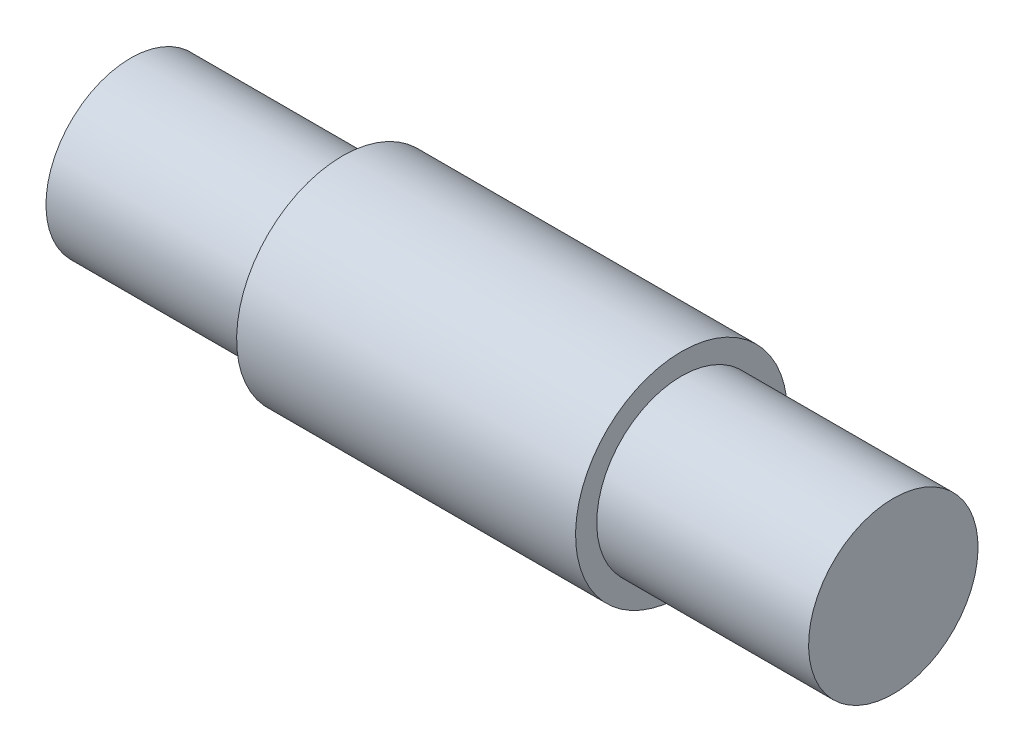
ISO-10303-21;
HEADER;
FILE_DESCRIPTION(('STEP AP214'),'2;1');
FILE_NAME('part.step','',(''),(''),'','','');
FILE_SCHEMA(('AUTOMOTIVE_DESIGN { 1 0 10303 214 1 1 1 1 }'));
ENDSEC;
DATA;
#1=APPLICATION_CONTEXT('core data for automotive mechanical design processes');
#2=APPLICATION_PROTOCOL_DEFINITION('international standard','automotive_design',2000,#1);
#3=PRODUCT_CONTEXT('',#1,'mechanical');
#4=PRODUCT('Part','Part','',(#3));
#5=PRODUCT_RELATED_PRODUCT_CATEGORY('part','',(#4));
#6=PRODUCT_DEFINITION_FORMATION('','',#4);
#7=PRODUCT_DEFINITION_CONTEXT('part definition',#1,'design');
#8=PRODUCT_DEFINITION('design','',#6,#7);
#9=PRODUCT_DEFINITION_SHAPE('','',#8);
#10=(LENGTH_UNIT() NAMED_UNIT(*) SI_UNIT(.MILLI.,.METRE.));
#11=(NAMED_UNIT(*) PLANE_ANGLE_UNIT() SI_UNIT($,.RADIAN.));
#12=(NAMED_UNIT(*) SI_UNIT($,.STERADIAN.) SOLID_ANGLE_UNIT());
#13=UNCERTAINTY_MEASURE_WITH_UNIT(LENGTH_MEASURE(1.E-05),#10,'distance_accuracy_value','');
#14=(GEOMETRIC_REPRESENTATION_CONTEXT(3) GLOBAL_UNCERTAINTY_ASSIGNED_CONTEXT((#13)) GLOBAL_UNIT_ASSIGNED_CONTEXT((#10,
#11,#12)) REPRESENTATION_CONTEXT('',''));
#15=CARTESIAN_POINT('',(0.,0.,0.));
#16=DIRECTION('',(0.,0.,1.));
#17=DIRECTION('',(1.,0.,0.));
#18=AXIS2_PLACEMENT_3D('',#15,#16,#17);
#19=CARTESIAN_POINT('',(9.,2.5,0.));
#20=DIRECTION('',(1.,0.,0.));
#21=DIRECTION('',(0.,1.,0.));
#22=AXIS2_PLACEMENT_3D('',#19,#20,#21);
#23=CYLINDRICAL_SURFACE('',#22,2.5);
#24=CARTESIAN_POINT('',(4.,2.5,0.));
#25=DIRECTION('',(1.,0.,0.));
#26=DIRECTION('',(0.,1.,0.));
#27=AXIS2_PLACEMENT_3D('',#24,#25,#26);
#28=CIRCLE('',#27,2.5);
#29=CARTESIAN_POINT('',(4.,5.,0.));
#30=VERTEX_POINT('',#29);
#31=EDGE_CURVE('E10',#30,#30,#28,.T.);
#32=ORIENTED_EDGE('',*,*,#31,.F.);
#33=EDGE_LOOP('',(#32));
#34=FACE_BOUND('',#33,.T.);
#35=CARTESIAN_POINT('',(-4.,2.5,0.));
#36=DIRECTION('',(1.,0.,0.));
#37=DIRECTION('',(0.,1.,0.));
#38=AXIS2_PLACEMENT_3D('',#35,#36,#37);
#39=CIRCLE('',#38,2.5);
#40=CARTESIAN_POINT('',(-4.,5.,0.));
#41=VERTEX_POINT('',#40);
#42=EDGE_CURVE('E45',#41,#41,#39,.T.);
#43=ORIENTED_EDGE('',*,*,#42,.T.);
#44=EDGE_LOOP('',(#43));
#45=FACE_BOUND('',#44,.T.);
#46=ADVANCED_FACE('F31',(#34,#45),#23,.T.);
#47=CARTESIAN_POINT('',(4.,0.,0.));
#48=DIRECTION('',(-1.,0.,0.));
#49=DIRECTION('',(0.,-1.,0.));
#50=AXIS2_PLACEMENT_3D('',#47,#48,#49);
#51=PLANE('',#50);
#52=CARTESIAN_POINT('',(4.,2.5,0.));
#53=DIRECTION('',(1.,0.,0.));
#54=DIRECTION('',(0.,1.,0.));
#55=AXIS2_PLACEMENT_3D('',#52,#53,#54);
#56=CIRCLE('',#55,2.);
#57=CARTESIAN_POINT('',(4.,4.5,0.));
#58=VERTEX_POINT('',#57);
#59=EDGE_CURVE('E37',#58,#58,#56,.T.);
#60=ORIENTED_EDGE('',*,*,#59,.F.);
#61=EDGE_LOOP('',(#60));
#62=FACE_BOUND('',#61,.T.);
#63=ORIENTED_EDGE('',*,*,#31,.T.);
#64=EDGE_LOOP('',(#63));
#65=FACE_BOUND('',#64,.T.);
#66=ADVANCED_FACE('F69',(#62,#65),#51,.F.);
#67=CARTESIAN_POINT('',(9.,2.5,0.));
#68=DIRECTION('',(1.,0.,0.));
#69=DIRECTION('',(0.,1.,0.));
#70=AXIS2_PLACEMENT_3D('',#67,#68,#69);
#71=CYLINDRICAL_SURFACE('',#70,2.);
#72=CARTESIAN_POINT('',(9.,2.5,0.));
#73=DIRECTION('',(1.,0.,0.));
#74=DIRECTION('',(0.,1.,0.));
#75=AXIS2_PLACEMENT_3D('',#72,#73,#74);
#76=CIRCLE('',#75,2.);
#77=CARTESIAN_POINT('',(9.,4.5,0.));
#78=VERTEX_POINT('',#77);
#79=EDGE_CURVE('E41',#78,#78,#76,.T.);
#80=ORIENTED_EDGE('',*,*,#79,.F.);
#81=EDGE_LOOP('',(#80));
#82=FACE_BOUND('',#81,.T.);
#83=ORIENTED_EDGE('',*,*,#59,.T.);
#84=EDGE_LOOP('',(#83));
#85=FACE_BOUND('',#84,.T.);
#86=ADVANCED_FACE('F74',(#82,#85),#71,.T.);
#87=CARTESIAN_POINT('',(9.,0.5,0.));
#88=DIRECTION('',(-1.,0.,0.));
#89=DIRECTION('',(0.,-1.,0.));
#90=AXIS2_PLACEMENT_3D('',#87,#88,#89);
#91=PLANE('',#90);
#92=ORIENTED_EDGE('',*,*,#79,.T.);
#93=EDGE_LOOP('',(#92));
#94=FACE_BOUND('',#93,.T.);
#95=ADVANCED_FACE('F80',(#94),#91,.F.);
#96=CARTESIAN_POINT('',(-4.,0.,0.));
#97=DIRECTION('',(1.,0.,0.));
#98=DIRECTION('',(0.,-1.,0.));
#99=AXIS2_PLACEMENT_3D('',#96,#97,#98);
#100=PLANE('',#99);
#101=CARTESIAN_POINT('',(-4.,2.5,0.));
#102=DIRECTION('',(1.,0.,0.));
#103=DIRECTION('',(0.,1.,0.));
#104=AXIS2_PLACEMENT_3D('',#101,#102,#103);
#105=CIRCLE('',#104,2.);
#106=CARTESIAN_POINT('',(-4.,4.5,0.));
#107=VERTEX_POINT('',#106);
#108=EDGE_CURVE('E50',#107,#107,#105,.T.);
#109=ORIENTED_EDGE('',*,*,#108,.T.);
#110=EDGE_LOOP('',(#109));
#111=FACE_BOUND('',#110,.T.);
#112=ORIENTED_EDGE('',*,*,#42,.F.);
#113=EDGE_LOOP('',(#112));
#114=FACE_BOUND('',#113,.T.);
#115=ADVANCED_FACE('F66',(#111,#114),#100,.F.);
#116=CARTESIAN_POINT('',(-9.,2.5,0.));
#117=DIRECTION('',(-1.,0.,0.));
#118=DIRECTION('',(0.,1.,0.));
#119=AXIS2_PLACEMENT_3D('',#116,#117,#118);
#120=CYLINDRICAL_SURFACE('',#119,2.);
#121=CARTESIAN_POINT('',(-9.,2.5,0.));
#122=DIRECTION('',(1.,0.,0.));
#123=DIRECTION('',(0.,1.,0.));
#124=AXIS2_PLACEMENT_3D('',#121,#122,#123);
#125=CIRCLE('',#124,2.);
#126=CARTESIAN_POINT('',(-9.,4.5,0.));
#127=VERTEX_POINT('',#126);
#128=EDGE_CURVE('E53',#127,#127,#125,.T.);
#129=ORIENTED_EDGE('',*,*,#128,.T.);
#130=EDGE_LOOP('',(#129));
#131=FACE_BOUND('',#130,.T.);
#132=ORIENTED_EDGE('',*,*,#108,.F.);
#133=EDGE_LOOP('',(#132));
#134=FACE_BOUND('',#133,.T.);
#135=ADVANCED_FACE('F57',(#131,#134),#120,.T.);
#136=CARTESIAN_POINT('',(-9.,0.499999999999996,0.));
#137=DIRECTION('',(1.,0.,0.));
#138=DIRECTION('',(0.,-1.,0.));
#139=AXIS2_PLACEMENT_3D('',#136,#137,#138);
#140=PLANE('',#139);
#141=ORIENTED_EDGE('',*,*,#128,.F.);
#142=EDGE_LOOP('',(#141));
#143=FACE_BOUND('',#142,.T.);
#144=ADVANCED_FACE('F60',(#143),#140,.F.);
#145=CLOSED_SHELL('',(#46,#66,#86,#95,#115,#135,#144));
#146=MANIFOLD_SOLID_BREP('B2',#145);
#147=ADVANCED_BREP_SHAPE_REPRESENTATION('',(#18,#146),#14);
#148=SHAPE_DEFINITION_REPRESENTATION(#9,#147);
ENDSEC;
END-ISO-10303-21;
